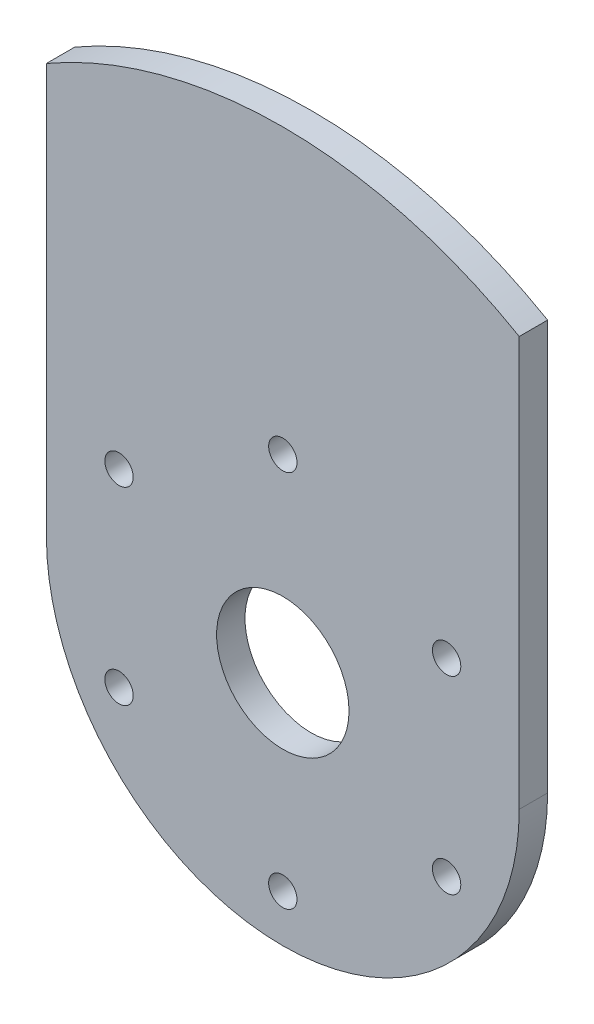
ISO-10303-21;
HEADER;
FILE_DESCRIPTION(('STEP AP214'),'2;1');
FILE_NAME('part.step','',(''),(''),'','','');
FILE_SCHEMA(('AUTOMOTIVE_DESIGN { 1 0 10303 214 1 1 1 1 }'));
ENDSEC;
DATA;
#1=APPLICATION_CONTEXT('core data for automotive mechanical design processes');
#2=APPLICATION_PROTOCOL_DEFINITION('international standard','automotive_design',2000,#1);
#3=PRODUCT_CONTEXT('',#1,'mechanical');
#4=PRODUCT('Part','Part','',(#3));
#5=PRODUCT_RELATED_PRODUCT_CATEGORY('part','',(#4));
#6=PRODUCT_DEFINITION_FORMATION('','',#4);
#7=PRODUCT_DEFINITION_CONTEXT('part definition',#1,'design');
#8=PRODUCT_DEFINITION('design','',#6,#7);
#9=PRODUCT_DEFINITION_SHAPE('','',#8);
#10=(LENGTH_UNIT() NAMED_UNIT(*) SI_UNIT(.MILLI.,.METRE.));
#11=(NAMED_UNIT(*) PLANE_ANGLE_UNIT() SI_UNIT($,.RADIAN.));
#12=(NAMED_UNIT(*) SI_UNIT($,.STERADIAN.) SOLID_ANGLE_UNIT());
#13=UNCERTAINTY_MEASURE_WITH_UNIT(LENGTH_MEASURE(1.E-05),#10,'distance_accuracy_value','');
#14=(GEOMETRIC_REPRESENTATION_CONTEXT(3) GLOBAL_UNCERTAINTY_ASSIGNED_CONTEXT((#13)) GLOBAL_UNIT_ASSIGNED_CONTEXT((#10,
#11,#12)) REPRESENTATION_CONTEXT('',''));
#15=CARTESIAN_POINT('',(0.,0.,0.));
#16=DIRECTION('',(0.,0.,1.));
#17=DIRECTION('',(1.,0.,0.));
#18=AXIS2_PLACEMENT_3D('',#15,#16,#17);
#19=CARTESIAN_POINT('',(0.,0.,3.));
#20=DIRECTION('',(0.,0.,-1.));
#21=DIRECTION('',(-1.,0.,0.));
#22=AXIS2_PLACEMENT_3D('',#19,#20,#21);
#23=CYLINDRICAL_SURFACE('',#22,50.);
#24=DIRECTION('',(0.,0.,1.));
#25=VECTOR('',#24,1.);
#26=CARTESIAN_POINT('',(25.,43.3012701892219,0.));
#27=LINE('',#26,#25);
#28=CARTESIAN_POINT('',(25.,43.3012701892219,0.));
#29=VERTEX_POINT('',#28);
#30=CARTESIAN_POINT('',(25.,43.3012701892219,3.));
#31=VERTEX_POINT('',#30);
#32=EDGE_CURVE('E215',#29,#31,#27,.T.);
#33=ORIENTED_EDGE('',*,*,#32,.F.);
#34=CARTESIAN_POINT('',(0.,0.,0.));
#35=DIRECTION('',(0.,0.,1.));
#36=DIRECTION('',(1.,0.,0.));
#37=AXIS2_PLACEMENT_3D('',#34,#35,#36);
#38=CIRCLE('',#37,50.);
#39=CARTESIAN_POINT('',(-25.,43.3012701892219,0.));
#40=VERTEX_POINT('',#39);
#41=EDGE_CURVE('E135',#29,#40,#38,.T.);
#42=ORIENTED_EDGE('',*,*,#41,.T.);
#43=DIRECTION('',(0.,0.,1.));
#44=VECTOR('',#43,1.);
#45=CARTESIAN_POINT('',(-25.,43.3012701892219,0.));
#46=LINE('',#45,#44);
#47=CARTESIAN_POINT('',(-25.,43.3012701892219,3.));
#48=VERTEX_POINT('',#47);
#49=EDGE_CURVE('E149',#40,#48,#46,.T.);
#50=ORIENTED_EDGE('',*,*,#49,.T.);
#51=CARTESIAN_POINT('',(0.,0.,3.));
#52=DIRECTION('',(0.,0.,1.));
#53=DIRECTION('',(1.,0.,0.));
#54=AXIS2_PLACEMENT_3D('',#51,#52,#53);
#55=CIRCLE('',#54,50.);
#56=EDGE_CURVE('E12',#31,#48,#55,.T.);
#57=ORIENTED_EDGE('',*,*,#56,.F.);
#58=EDGE_LOOP('',(#33,#42,#50,#57));
#59=FACE_BOUND('',#58,.T.);
#60=ADVANCED_FACE('F131',(#59),#23,.T.);
#61=CARTESIAN_POINT('',(0.,0.,3.));
#62=DIRECTION('',(0.,0.,1.));
#63=DIRECTION('',(1.,0.,0.));
#64=AXIS2_PLACEMENT_3D('',#61,#62,#63);
#65=PLANE('',#64);
#66=CARTESIAN_POINT('',(17.3205080756901,-9.99999999999926,3.));
#67=DIRECTION('',(0.,0.,1.));
#68=DIRECTION('',(1.,0.,0.));
#69=AXIS2_PLACEMENT_3D('',#66,#67,#68);
#70=CIRCLE('',#69,1.50000000000181);
#71=CARTESIAN_POINT('',(18.8205080756919,-9.99999999999926,3.));
#72=VERTEX_POINT('',#71);
#73=EDGE_CURVE('E289',#72,#72,#70,.T.);
#74=ORIENTED_EDGE('',*,*,#73,.F.);
#75=EDGE_LOOP('',(#74));
#76=FACE_BOUND('',#75,.T.);
#77=CARTESIAN_POINT('',(-17.3205080756884,9.99999999999925,3.));
#78=DIRECTION('',(0.,0.,1.));
#79=DIRECTION('',(1.,0.,0.));
#80=AXIS2_PLACEMENT_3D('',#77,#78,#79);
#81=CIRCLE('',#80,1.50000000000181);
#82=CARTESIAN_POINT('',(-15.8205080756865,9.99999999999925,3.));
#83=VERTEX_POINT('',#82);
#84=EDGE_CURVE('E302',#83,#83,#81,.T.);
#85=ORIENTED_EDGE('',*,*,#84,.F.);
#86=EDGE_LOOP('',(#85));
#87=FACE_BOUND('',#86,.T.);
#88=CARTESIAN_POINT('',(-17.3205080756875,-10.0000000000007,3.));
#89=DIRECTION('',(0.,0.,1.));
#90=DIRECTION('',(1.,0.,0.));
#91=AXIS2_PLACEMENT_3D('',#88,#89,#90);
#92=CIRCLE('',#91,1.50000000000181);
#93=CARTESIAN_POINT('',(-15.8205080756857,-10.0000000000007,3.));
#94=VERTEX_POINT('',#93);
#95=EDGE_CURVE('E201',#94,#94,#92,.T.);
#96=ORIENTED_EDGE('',*,*,#95,.F.);
#97=EDGE_LOOP('',(#96));
#98=FACE_BOUND('',#97,.T.);
#99=CARTESIAN_POINT('',(1.70040397862765E-12,-20.,3.));
#100=DIRECTION('',(0.,0.,1.));
#101=DIRECTION('',(1.,0.,0.));
#102=AXIS2_PLACEMENT_3D('',#99,#100,#101);
#103=CIRCLE('',#102,1.50000000000181);
#104=CARTESIAN_POINT('',(1.50000000000351,-20.,3.));
#105=VERTEX_POINT('',#104);
#106=EDGE_CURVE('E316',#105,#105,#103,.T.);
#107=ORIENTED_EDGE('',*,*,#106,.F.);
#108=EDGE_LOOP('',(#107));
#109=FACE_BOUND('',#108,.T.);
#110=CARTESIAN_POINT('',(0.,20.,3.));
#111=DIRECTION('',(0.,0.,1.));
#112=DIRECTION('',(1.,0.,0.));
#113=AXIS2_PLACEMENT_3D('',#110,#111,#112);
#114=CIRCLE('',#113,1.50000000000181);
#115=CARTESIAN_POINT('',(1.50000000000181,20.,3.));
#116=VERTEX_POINT('',#115);
#117=EDGE_CURVE('E282',#116,#116,#114,.T.);
#118=ORIENTED_EDGE('',*,*,#117,.F.);
#119=EDGE_LOOP('',(#118));
#120=FACE_BOUND('',#119,.T.);
#121=CARTESIAN_POINT('',(17.3205080756892,10.0000000000007,3.));
#122=DIRECTION('',(0.,0.,1.));
#123=DIRECTION('',(1.,0.,0.));
#124=AXIS2_PLACEMENT_3D('',#121,#122,#123);
#125=CIRCLE('',#124,1.50000000000181);
#126=CARTESIAN_POINT('',(18.820508075691,10.0000000000007,3.));
#127=VERTEX_POINT('',#126);
#128=EDGE_CURVE('E292',#127,#127,#125,.T.);
#129=ORIENTED_EDGE('',*,*,#128,.F.);
#130=EDGE_LOOP('',(#129));
#131=FACE_BOUND('',#130,.T.);
#132=CARTESIAN_POINT('',(0.,0.,3.));
#133=DIRECTION('',(0.,0.,1.));
#134=DIRECTION('',(1.,0.,0.));
#135=AXIS2_PLACEMENT_3D('',#132,#133,#134);
#136=CIRCLE('',#135,7.);
#137=CARTESIAN_POINT('',(7.,0.,3.));
#138=VERTEX_POINT('',#137);
#139=EDGE_CURVE('E141',#138,#138,#136,.T.);
#140=ORIENTED_EDGE('',*,*,#139,.F.);
#141=EDGE_LOOP('',(#140));
#142=FACE_BOUND('',#141,.T.);
#143=CARTESIAN_POINT('',(0.,0.,3.));
#144=DIRECTION('',(0.,0.,1.));
#145=DIRECTION('',(1.,0.,0.));
#146=AXIS2_PLACEMENT_3D('',#143,#144,#145);
#147=CIRCLE('',#146,25.);
#148=CARTESIAN_POINT('',(-25.,0.,3.));
#149=VERTEX_POINT('',#148);
#150=CARTESIAN_POINT('',(25.,0.,3.));
#151=VERTEX_POINT('',#150);
#152=EDGE_CURVE('E181',#149,#151,#147,.T.);
#153=ORIENTED_EDGE('',*,*,#152,.T.);
#154=DIRECTION('',(0.,1.,0.));
#155=VECTOR('',#154,1.);
#156=CARTESIAN_POINT('',(25.,0.,3.));
#157=LINE('',#156,#155);
#158=EDGE_CURVE('E176',#151,#31,#157,.T.);
#159=ORIENTED_EDGE('',*,*,#158,.T.);
#160=ORIENTED_EDGE('',*,*,#56,.T.);
#161=DIRECTION('',(0.,1.,0.));
#162=VECTOR('',#161,1.);
#163=CARTESIAN_POINT('',(-25.,0.,3.));
#164=LINE('',#163,#162);
#165=EDGE_CURVE('E198',#149,#48,#164,.T.);
#166=ORIENTED_EDGE('',*,*,#165,.F.);
#167=EDGE_LOOP('',(#153,#159,#160,#166));
#168=FACE_BOUND('',#167,.T.);
#169=ADVANCED_FACE('F232',(#76,#87,#98,#109,#120,#131,#142,#168),#65,.T.);
#170=CARTESIAN_POINT('',(0.,0.,0.));
#171=DIRECTION('',(0.,0.,1.));
#172=DIRECTION('',(1.,0.,0.));
#173=AXIS2_PLACEMENT_3D('',#170,#171,#172);
#174=PLANE('',#173);
#175=CARTESIAN_POINT('',(17.3205080756901,-9.99999999999926,0.));
#176=DIRECTION('',(0.,0.,1.));
#177=DIRECTION('',(1.,0.,0.));
#178=AXIS2_PLACEMENT_3D('',#175,#176,#177);
#179=CIRCLE('',#178,1.50000000000181);
#180=CARTESIAN_POINT('',(18.8205080756919,-9.99999999999926,0.));
#181=VERTEX_POINT('',#180);
#182=EDGE_CURVE('E306',#181,#181,#179,.T.);
#183=ORIENTED_EDGE('',*,*,#182,.T.);
#184=EDGE_LOOP('',(#183));
#185=FACE_BOUND('',#184,.T.);
#186=CARTESIAN_POINT('',(-17.3205080756884,9.99999999999925,0.));
#187=DIRECTION('',(0.,0.,1.));
#188=DIRECTION('',(1.,0.,0.));
#189=AXIS2_PLACEMENT_3D('',#186,#187,#188);
#190=CIRCLE('',#189,1.50000000000181);
#191=CARTESIAN_POINT('',(-15.8205080756865,9.99999999999925,0.));
#192=VERTEX_POINT('',#191);
#193=EDGE_CURVE('E298',#192,#192,#190,.T.);
#194=ORIENTED_EDGE('',*,*,#193,.T.);
#195=EDGE_LOOP('',(#194));
#196=FACE_BOUND('',#195,.T.);
#197=CARTESIAN_POINT('',(-17.3205080756875,-10.0000000000007,0.));
#198=DIRECTION('',(0.,0.,1.));
#199=DIRECTION('',(1.,0.,0.));
#200=AXIS2_PLACEMENT_3D('',#197,#198,#199);
#201=CIRCLE('',#200,1.50000000000181);
#202=CARTESIAN_POINT('',(-15.8205080756857,-10.0000000000007,0.));
#203=VERTEX_POINT('',#202);
#204=EDGE_CURVE('E319',#203,#203,#201,.T.);
#205=ORIENTED_EDGE('',*,*,#204,.T.);
#206=EDGE_LOOP('',(#205));
#207=FACE_BOUND('',#206,.T.);
#208=CARTESIAN_POINT('',(1.70040397862765E-12,-20.,0.));
#209=DIRECTION('',(0.,0.,1.));
#210=DIRECTION('',(1.,0.,0.));
#211=AXIS2_PLACEMENT_3D('',#208,#209,#210);
#212=CIRCLE('',#211,1.50000000000181);
#213=CARTESIAN_POINT('',(1.50000000000351,-20.,0.));
#214=VERTEX_POINT('',#213);
#215=EDGE_CURVE('E208',#214,#214,#212,.T.);
#216=ORIENTED_EDGE('',*,*,#215,.T.);
#217=EDGE_LOOP('',(#216));
#218=FACE_BOUND('',#217,.T.);
#219=CARTESIAN_POINT('',(0.,20.,0.));
#220=DIRECTION('',(0.,0.,1.));
#221=DIRECTION('',(1.,0.,0.));
#222=AXIS2_PLACEMENT_3D('',#219,#220,#221);
#223=CIRCLE('',#222,1.50000000000181);
#224=CARTESIAN_POINT('',(1.50000000000181,20.,0.));
#225=VERTEX_POINT('',#224);
#226=EDGE_CURVE('E279',#225,#225,#223,.T.);
#227=ORIENTED_EDGE('',*,*,#226,.T.);
#228=EDGE_LOOP('',(#227));
#229=FACE_BOUND('',#228,.T.);
#230=CARTESIAN_POINT('',(17.3205080756892,10.0000000000007,0.));
#231=DIRECTION('',(0.,0.,1.));
#232=DIRECTION('',(1.,0.,0.));
#233=AXIS2_PLACEMENT_3D('',#230,#231,#232);
#234=CIRCLE('',#233,1.50000000000181);
#235=CARTESIAN_POINT('',(18.820508075691,10.0000000000007,0.));
#236=VERTEX_POINT('',#235);
#237=EDGE_CURVE('E285',#236,#236,#234,.T.);
#238=ORIENTED_EDGE('',*,*,#237,.T.);
#239=EDGE_LOOP('',(#238));
#240=FACE_BOUND('',#239,.T.);
#241=CARTESIAN_POINT('',(0.,0.,0.));
#242=DIRECTION('',(0.,0.,1.));
#243=DIRECTION('',(1.,0.,0.));
#244=AXIS2_PLACEMENT_3D('',#241,#242,#243);
#245=CIRCLE('',#244,7.);
#246=CARTESIAN_POINT('',(7.,0.,0.));
#247=VERTEX_POINT('',#246);
#248=EDGE_CURVE('E214',#247,#247,#245,.T.);
#249=ORIENTED_EDGE('',*,*,#248,.T.);
#250=EDGE_LOOP('',(#249));
#251=FACE_BOUND('',#250,.T.);
#252=DIRECTION('',(0.,1.,0.));
#253=VECTOR('',#252,1.);
#254=CARTESIAN_POINT('',(25.,0.,0.));
#255=LINE('',#254,#253);
#256=CARTESIAN_POINT('',(25.,0.,0.));
#257=VERTEX_POINT('',#256);
#258=EDGE_CURVE('E184',#257,#29,#255,.T.);
#259=ORIENTED_EDGE('',*,*,#258,.F.);
#260=CARTESIAN_POINT('',(0.,0.,0.));
#261=DIRECTION('',(0.,0.,1.));
#262=DIRECTION('',(1.,0.,0.));
#263=AXIS2_PLACEMENT_3D('',#260,#261,#262);
#264=CIRCLE('',#263,25.);
#265=CARTESIAN_POINT('',(-25.,0.,0.));
#266=VERTEX_POINT('',#265);
#267=EDGE_CURVE('E158',#266,#257,#264,.T.);
#268=ORIENTED_EDGE('',*,*,#267,.F.);
#269=DIRECTION('',(0.,1.,0.));
#270=VECTOR('',#269,1.);
#271=CARTESIAN_POINT('',(-25.,0.,0.));
#272=LINE('',#271,#270);
#273=EDGE_CURVE('E186',#266,#40,#272,.T.);
#274=ORIENTED_EDGE('',*,*,#273,.T.);
#275=ORIENTED_EDGE('',*,*,#41,.F.);
#276=EDGE_LOOP('',(#259,#268,#274,#275));
#277=FACE_BOUND('',#276,.T.);
#278=ADVANCED_FACE('F194',(#185,#196,#207,#218,#229,#240,#251,#277),#174,.F.);
#279=CARTESIAN_POINT('',(0.,0.,3.));
#280=DIRECTION('',(0.,0.,-1.));
#281=DIRECTION('',(-1.,0.,0.));
#282=AXIS2_PLACEMENT_3D('',#279,#280,#281);
#283=CYLINDRICAL_SURFACE('',#282,7.);
#284=ORIENTED_EDGE('',*,*,#139,.T.);
#285=EDGE_LOOP('',(#284));
#286=FACE_BOUND('',#285,.T.);
#287=ORIENTED_EDGE('',*,*,#248,.F.);
#288=EDGE_LOOP('',(#287));
#289=FACE_BOUND('',#288,.T.);
#290=ADVANCED_FACE('F133',(#286,#289),#283,.F.);
#291=CARTESIAN_POINT('',(0.,0.,0.));
#292=DIRECTION('',(0.,0.,1.));
#293=DIRECTION('',(1.,0.,0.));
#294=AXIS2_PLACEMENT_3D('',#291,#292,#293);
#295=CYLINDRICAL_SURFACE('',#294,25.);
#296=ORIENTED_EDGE('',*,*,#152,.F.);
#297=DIRECTION('',(0.,0.,1.));
#298=VECTOR('',#297,1.);
#299=CARTESIAN_POINT('',(-25.,0.,0.));
#300=LINE('',#299,#298);
#301=EDGE_CURVE('E178',#266,#149,#300,.T.);
#302=ORIENTED_EDGE('',*,*,#301,.F.);
#303=ORIENTED_EDGE('',*,*,#267,.T.);
#304=DIRECTION('',(0.,0.,1.));
#305=VECTOR('',#304,1.);
#306=CARTESIAN_POINT('',(25.,0.,0.));
#307=LINE('',#306,#305);
#308=EDGE_CURVE('E211',#257,#151,#307,.T.);
#309=ORIENTED_EDGE('',*,*,#308,.T.);
#310=EDGE_LOOP('',(#296,#302,#303,#309));
#311=FACE_BOUND('',#310,.T.);
#312=ADVANCED_FACE('F179',(#311),#295,.T.);
#313=CARTESIAN_POINT('',(25.,0.,0.));
#314=DIRECTION('',(1.,0.,0.));
#315=DIRECTION('',(0.,0.,-1.));
#316=AXIS2_PLACEMENT_3D('',#313,#314,#315);
#317=PLANE('',#316);
#318=ORIENTED_EDGE('',*,*,#158,.F.);
#319=ORIENTED_EDGE('',*,*,#308,.F.);
#320=ORIENTED_EDGE('',*,*,#258,.T.);
#321=ORIENTED_EDGE('',*,*,#32,.T.);
#322=EDGE_LOOP('',(#318,#319,#320,#321));
#323=FACE_BOUND('',#322,.T.);
#324=ADVANCED_FACE('F230',(#323),#317,.T.);
#325=CARTESIAN_POINT('',(-25.,0.,0.));
#326=DIRECTION('',(1.,0.,0.));
#327=DIRECTION('',(0.,0.,-1.));
#328=AXIS2_PLACEMENT_3D('',#325,#326,#327);
#329=PLANE('',#328);
#330=ORIENTED_EDGE('',*,*,#165,.T.);
#331=ORIENTED_EDGE('',*,*,#49,.F.);
#332=ORIENTED_EDGE('',*,*,#273,.F.);
#333=ORIENTED_EDGE('',*,*,#301,.T.);
#334=EDGE_LOOP('',(#330,#331,#332,#333));
#335=FACE_BOUND('',#334,.T.);
#336=ADVANCED_FACE('F187',(#335),#329,.F.);
#337=CARTESIAN_POINT('',(17.3205080756892,10.0000000000007,0.));
#338=DIRECTION('',(0.,0.,1.));
#339=DIRECTION('',(1.,0.,0.));
#340=AXIS2_PLACEMENT_3D('',#337,#338,#339);
#341=CYLINDRICAL_SURFACE('',#340,1.50000000000181);
#342=ORIENTED_EDGE('',*,*,#237,.F.);
#343=EDGE_LOOP('',(#342));
#344=FACE_BOUND('',#343,.T.);
#345=ORIENTED_EDGE('',*,*,#128,.T.);
#346=EDGE_LOOP('',(#345));
#347=FACE_BOUND('',#346,.T.);
#348=ADVANCED_FACE('F249',(#344,#347),#341,.F.);
#349=CARTESIAN_POINT('',(0.,20.,0.));
#350=DIRECTION('',(0.,0.,1.));
#351=DIRECTION('',(1.,0.,0.));
#352=AXIS2_PLACEMENT_3D('',#349,#350,#351);
#353=CYLINDRICAL_SURFACE('',#352,1.50000000000181);
#354=ORIENTED_EDGE('',*,*,#226,.F.);
#355=EDGE_LOOP('',(#354));
#356=FACE_BOUND('',#355,.T.);
#357=ORIENTED_EDGE('',*,*,#117,.T.);
#358=EDGE_LOOP('',(#357));
#359=FACE_BOUND('',#358,.T.);
#360=ADVANCED_FACE('F260',(#356,#359),#353,.F.);
#361=CARTESIAN_POINT('',(1.70040397862765E-12,-20.,0.));
#362=DIRECTION('',(0.,0.,1.));
#363=DIRECTION('',(1.,0.,0.));
#364=AXIS2_PLACEMENT_3D('',#361,#362,#363);
#365=CYLINDRICAL_SURFACE('',#364,1.50000000000181);
#366=ORIENTED_EDGE('',*,*,#215,.F.);
#367=EDGE_LOOP('',(#366));
#368=FACE_BOUND('',#367,.T.);
#369=ORIENTED_EDGE('',*,*,#106,.T.);
#370=EDGE_LOOP('',(#369));
#371=FACE_BOUND('',#370,.T.);
#372=ADVANCED_FACE('F256',(#368,#371),#365,.F.);
#373=CARTESIAN_POINT('',(-17.3205080756875,-10.0000000000007,0.));
#374=DIRECTION('',(0.,0.,1.));
#375=DIRECTION('',(1.,0.,0.));
#376=AXIS2_PLACEMENT_3D('',#373,#374,#375);
#377=CYLINDRICAL_SURFACE('',#376,1.50000000000181);
#378=ORIENTED_EDGE('',*,*,#204,.F.);
#379=EDGE_LOOP('',(#378));
#380=FACE_BOUND('',#379,.T.);
#381=ORIENTED_EDGE('',*,*,#95,.T.);
#382=EDGE_LOOP('',(#381));
#383=FACE_BOUND('',#382,.T.);
#384=ADVANCED_FACE('F252',(#380,#383),#377,.F.);
#385=CARTESIAN_POINT('',(-17.3205080756884,9.99999999999925,0.));
#386=DIRECTION('',(0.,0.,1.));
#387=DIRECTION('',(1.,0.,0.));
#388=AXIS2_PLACEMENT_3D('',#385,#386,#387);
#389=CYLINDRICAL_SURFACE('',#388,1.50000000000181);
#390=ORIENTED_EDGE('',*,*,#193,.F.);
#391=EDGE_LOOP('',(#390));
#392=FACE_BOUND('',#391,.T.);
#393=ORIENTED_EDGE('',*,*,#84,.T.);
#394=EDGE_LOOP('',(#393));
#395=FACE_BOUND('',#394,.T.);
#396=ADVANCED_FACE('F255',(#392,#395),#389,.F.);
#397=CARTESIAN_POINT('',(17.3205080756901,-9.99999999999926,0.));
#398=DIRECTION('',(0.,0.,1.));
#399=DIRECTION('',(1.,0.,0.));
#400=AXIS2_PLACEMENT_3D('',#397,#398,#399);
#401=CYLINDRICAL_SURFACE('',#400,1.50000000000181);
#402=ORIENTED_EDGE('',*,*,#182,.F.);
#403=EDGE_LOOP('',(#402));
#404=FACE_BOUND('',#403,.T.);
#405=ORIENTED_EDGE('',*,*,#73,.T.);
#406=EDGE_LOOP('',(#405));
#407=FACE_BOUND('',#406,.T.);
#408=ADVANCED_FACE('F262',(#404,#407),#401,.F.);
#409=CLOSED_SHELL('',(#60,#169,#278,#290,#312,#324,#336,#348,#360,#372,#384,#396,#408));
#410=MANIFOLD_SOLID_BREP('B2',#409);
#411=ADVANCED_BREP_SHAPE_REPRESENTATION('',(#18,#410),#14);
#412=SHAPE_DEFINITION_REPRESENTATION(#9,#411);
ENDSEC;
END-ISO-10303-21;
